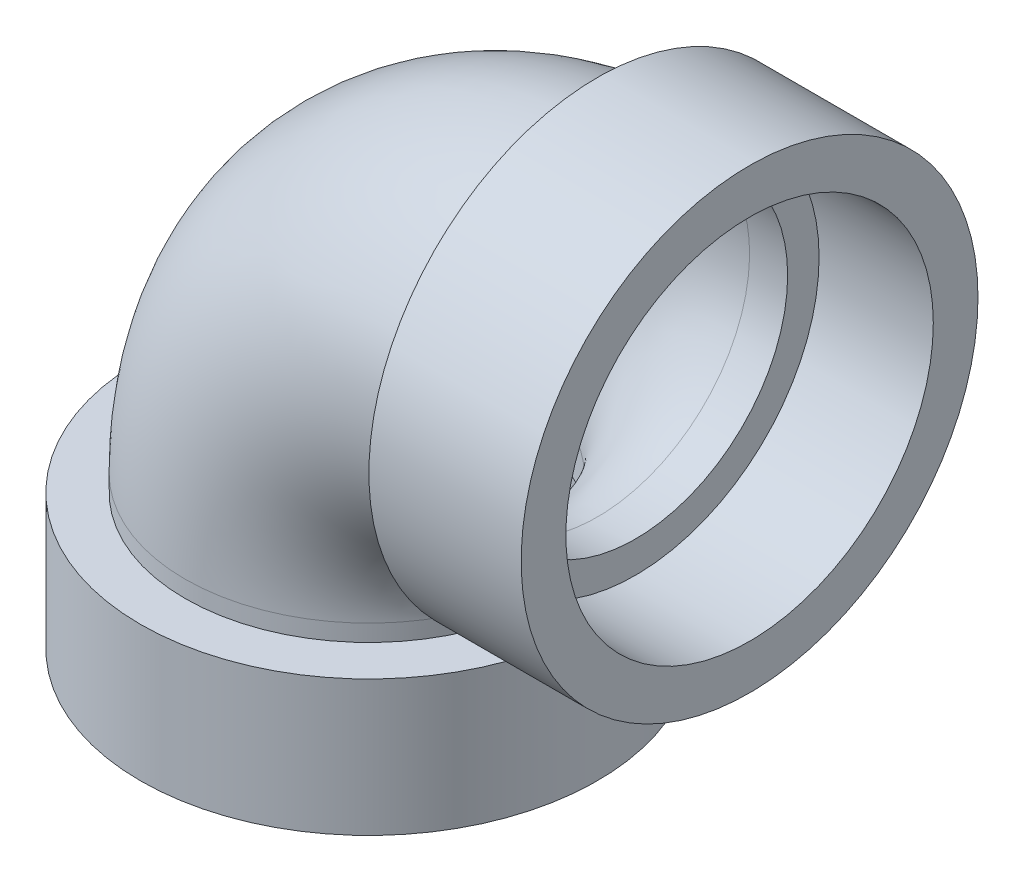
ISO-10303-21;
HEADER;
FILE_DESCRIPTION(('STEP AP214'),'2;1');
FILE_NAME('part.step','',(''),(''),'','','');
FILE_SCHEMA(('AUTOMOTIVE_DESIGN { 1 0 10303 214 1 1 1 1 }'));
ENDSEC;
DATA;
#1=APPLICATION_CONTEXT('core data for automotive mechanical design processes');
#2=APPLICATION_PROTOCOL_DEFINITION('international standard','automotive_design',2000,#1);
#3=PRODUCT_CONTEXT('',#1,'mechanical');
#4=PRODUCT('Part','Part','',(#3));
#5=PRODUCT_RELATED_PRODUCT_CATEGORY('part','',(#4));
#6=PRODUCT_DEFINITION_FORMATION('','',#4);
#7=PRODUCT_DEFINITION_CONTEXT('part definition',#1,'design');
#8=PRODUCT_DEFINITION('design','',#6,#7);
#9=PRODUCT_DEFINITION_SHAPE('','',#8);
#10=(LENGTH_UNIT() NAMED_UNIT(*) SI_UNIT(.MILLI.,.METRE.));
#11=(NAMED_UNIT(*) PLANE_ANGLE_UNIT() SI_UNIT($,.RADIAN.));
#12=(NAMED_UNIT(*) SI_UNIT($,.STERADIAN.) SOLID_ANGLE_UNIT());
#13=UNCERTAINTY_MEASURE_WITH_UNIT(LENGTH_MEASURE(1.E-05),#10,'distance_accuracy_value','');
#14=(GEOMETRIC_REPRESENTATION_CONTEXT(3) GLOBAL_UNCERTAINTY_ASSIGNED_CONTEXT((#13)) GLOBAL_UNIT_ASSIGNED_CONTEXT((#10,
#11,#12)) REPRESENTATION_CONTEXT('',''));
#15=CARTESIAN_POINT('',(0.,0.,0.));
#16=DIRECTION('',(0.,0.,1.));
#17=DIRECTION('',(1.,0.,0.));
#18=AXIS2_PLACEMENT_3D('',#15,#16,#17);
#19=CARTESIAN_POINT('',(0.,0.,0.));
#20=DIRECTION('',(0.,1.,0.));
#21=DIRECTION('',(0.,0.,1.));
#22=AXIS2_PLACEMENT_3D('',#19,#20,#21);
#23=CYLINDRICAL_SURFACE('',#22,30.);
#24=CARTESIAN_POINT('',(0.,0.,0.));
#25=DIRECTION('',(0.,1.,0.));
#26=DIRECTION('',(0.,0.,1.));
#27=AXIS2_PLACEMENT_3D('',#24,#25,#26);
#28=CIRCLE('',#27,30.);
#29=CARTESIAN_POINT('',(0.,0.,30.));
#30=VERTEX_POINT('',#29);
#31=EDGE_CURVE('E47',#30,#30,#28,.T.);
#32=ORIENTED_EDGE('',*,*,#31,.T.);
#33=EDGE_LOOP('',(#32));
#34=FACE_BOUND('',#33,.T.);
#35=CARTESIAN_POINT('',(0.,17.8,0.));
#36=DIRECTION('',(0.,1.,0.));
#37=DIRECTION('',(0.,0.,1.));
#38=AXIS2_PLACEMENT_3D('',#35,#36,#37);
#39=CIRCLE('',#38,30.);
#40=CARTESIAN_POINT('',(0.,17.8,30.));
#41=VERTEX_POINT('',#40);
#42=EDGE_CURVE('E154',#41,#41,#39,.T.);
#43=ORIENTED_EDGE('',*,*,#42,.F.);
#44=EDGE_LOOP('',(#43));
#45=FACE_BOUND('',#44,.T.);
#46=ADVANCED_FACE('F39',(#34,#45),#23,.T.);
#47=CARTESIAN_POINT('',(0.,0.,0.));
#48=DIRECTION('',(0.,1.,0.));
#49=DIRECTION('',(0.,0.,1.));
#50=AXIS2_PLACEMENT_3D('',#47,#48,#49);
#51=PLANE('',#50);
#52=CARTESIAN_POINT('',(0.,0.,0.));
#53=DIRECTION('',(0.,-1.,0.));
#54=DIRECTION('',(0.,0.,-1.));
#55=AXIS2_PLACEMENT_3D('',#52,#53,#54);
#56=CIRCLE('',#55,24.13);
#57=CARTESIAN_POINT('',(0.,0.,-24.13));
#58=VERTEX_POINT('',#57);
#59=EDGE_CURVE('E61',#58,#58,#56,.T.);
#60=ORIENTED_EDGE('',*,*,#59,.F.);
#61=EDGE_LOOP('',(#60));
#62=FACE_BOUND('',#61,.T.);
#63=ORIENTED_EDGE('',*,*,#31,.F.);
#64=EDGE_LOOP('',(#63));
#65=FACE_BOUND('',#64,.T.);
#66=ADVANCED_FACE('F41',(#62,#65),#51,.F.);
#67=CARTESIAN_POINT('',(50.,50.,0.));
#68=DIRECTION('',(1.,0.,0.));
#69=DIRECTION('',(0.,0.,1.));
#70=AXIS2_PLACEMENT_3D('',#67,#68,#69);
#71=PLANE('',#70);
#72=CARTESIAN_POINT('',(50.,50.,0.));
#73=DIRECTION('',(1.,0.,0.));
#74=DIRECTION('',(0.,0.,-1.));
#75=AXIS2_PLACEMENT_3D('',#72,#73,#74);
#76=CIRCLE('',#75,24.13);
#77=CARTESIAN_POINT('',(50.,50.,-24.13));
#78=VERTEX_POINT('',#77);
#79=EDGE_CURVE('E75',#78,#78,#76,.T.);
#80=ORIENTED_EDGE('',*,*,#79,.F.);
#81=EDGE_LOOP('',(#80));
#82=FACE_BOUND('',#81,.T.);
#83=CARTESIAN_POINT('',(50.,50.,0.));
#84=DIRECTION('',(1.,0.,0.));
#85=DIRECTION('',(0.,0.,1.));
#86=AXIS2_PLACEMENT_3D('',#83,#84,#85);
#87=CIRCLE('',#86,30.);
#88=CARTESIAN_POINT('',(50.,50.,-30.));
#89=VERTEX_POINT('',#88);
#90=EDGE_CURVE('E10',#89,#89,#87,.T.);
#91=ORIENTED_EDGE('',*,*,#90,.T.);
#92=EDGE_LOOP('',(#91));
#93=FACE_BOUND('',#92,.T.);
#94=ADVANCED_FACE('F84',(#82,#93),#71,.T.);
#95=CARTESIAN_POINT('',(30.,50.,0.));
#96=DIRECTION('',(1.,0.,0.));
#97=DIRECTION('',(0.,0.,-1.));
#98=AXIS2_PLACEMENT_3D('',#95,#96,#97);
#99=CYLINDRICAL_SURFACE('',#98,30.);
#100=CARTESIAN_POINT('',(30.,50.,0.));
#101=DIRECTION('',(1.,0.,0.));
#102=DIRECTION('',(0.,0.,1.));
#103=AXIS2_PLACEMENT_3D('',#100,#101,#102);
#104=CIRCLE('',#103,30.);
#105=CARTESIAN_POINT('',(30.,50.,-30.));
#106=VERTEX_POINT('',#105);
#107=EDGE_CURVE('E150',#106,#106,#104,.T.);
#108=CARTESIAN_POINT('',(50.,50.,-30.));
#109=CARTESIAN_POINT('',(49.7916666666667,50.,-30.));
#110=CARTESIAN_POINT('',(49.5833333333333,50.,-30.));
#111=CARTESIAN_POINT('',(49.1666666666667,50.,-30.));
#112=CARTESIAN_POINT('',(48.9583333333333,50.,-30.));
#113=CARTESIAN_POINT('',(48.5416666666667,50.,-30.));
#114=CARTESIAN_POINT('',(48.3333333333333,50.,-30.));
#115=CARTESIAN_POINT('',(47.9166666666667,50.,-30.));
#116=CARTESIAN_POINT('',(47.7083333333333,50.,-30.));
#117=CARTESIAN_POINT('',(47.2916666666667,50.,-30.));
#118=CARTESIAN_POINT('',(47.0833333333333,50.,-30.));
#119=CARTESIAN_POINT('',(46.6666666666667,50.,-30.));
#120=CARTESIAN_POINT('',(46.4583333333333,50.,-30.));
#121=CARTESIAN_POINT('',(46.0416666666667,50.,-30.));
#122=CARTESIAN_POINT('',(45.8333333333333,50.,-30.));
#123=CARTESIAN_POINT('',(45.4166666666667,50.,-30.));
#124=CARTESIAN_POINT('',(45.2083333333333,50.,-30.));
#125=CARTESIAN_POINT('',(44.7916666666667,50.,-30.));
#126=CARTESIAN_POINT('',(44.5833333333333,50.,-30.));
#127=CARTESIAN_POINT('',(44.1666666666667,50.,-30.));
#128=CARTESIAN_POINT('',(43.9583333333333,50.,-30.));
#129=CARTESIAN_POINT('',(43.5416666666667,50.,-30.));
#130=CARTESIAN_POINT('',(43.3333333333333,50.,-30.));
#131=CARTESIAN_POINT('',(42.9166666666667,50.,-30.));
#132=CARTESIAN_POINT('',(42.7083333333333,50.,-30.));
#133=CARTESIAN_POINT('',(42.2916666666667,50.,-30.));
#134=CARTESIAN_POINT('',(42.0833333333333,50.,-30.));
#135=CARTESIAN_POINT('',(41.6666666666667,50.,-30.));
#136=CARTESIAN_POINT('',(41.4583333333333,50.,-30.));
#137=CARTESIAN_POINT('',(41.0416666666667,50.,-30.));
#138=CARTESIAN_POINT('',(40.8333333333333,50.,-30.));
#139=CARTESIAN_POINT('',(40.4166666666667,50.,-30.));
#140=CARTESIAN_POINT('',(40.2083333333333,50.,-30.));
#141=CARTESIAN_POINT('',(39.7916666666667,50.,-30.));
#142=CARTESIAN_POINT('',(39.5833333333333,50.,-30.));
#143=CARTESIAN_POINT('',(39.1666666666667,50.,-30.));
#144=CARTESIAN_POINT('',(38.9583333333333,50.,-30.));
#145=CARTESIAN_POINT('',(38.5416666666667,50.,-30.));
#146=CARTESIAN_POINT('',(38.3333333333333,50.,-30.));
#147=CARTESIAN_POINT('',(37.9166666666667,50.,-30.));
#148=CARTESIAN_POINT('',(37.7083333333333,50.,-30.));
#149=CARTESIAN_POINT('',(37.2916666666667,50.,-30.));
#150=CARTESIAN_POINT('',(37.0833333333333,50.,-30.));
#151=CARTESIAN_POINT('',(36.6666666666667,50.,-30.));
#152=CARTESIAN_POINT('',(36.4583333333333,50.,-30.));
#153=CARTESIAN_POINT('',(36.0416666666667,50.,-30.));
#154=CARTESIAN_POINT('',(35.8333333333333,50.,-30.));
#155=CARTESIAN_POINT('',(35.4166666666667,50.,-30.));
#156=CARTESIAN_POINT('',(35.2083333333333,50.,-30.));
#157=CARTESIAN_POINT('',(34.7916666666667,50.,-30.));
#158=CARTESIAN_POINT('',(34.5833333333333,50.,-30.));
#159=CARTESIAN_POINT('',(34.1666666666667,50.,-30.));
#160=CARTESIAN_POINT('',(33.9583333333333,50.,-30.));
#161=CARTESIAN_POINT('',(33.5416666666667,50.,-30.));
#162=CARTESIAN_POINT('',(33.3333333333333,50.,-30.));
#163=CARTESIAN_POINT('',(32.9166666666667,50.,-30.));
#164=CARTESIAN_POINT('',(32.7083333333333,50.,-30.));
#165=CARTESIAN_POINT('',(32.2916666666667,50.,-30.));
#166=CARTESIAN_POINT('',(32.0833333333333,50.,-30.));
#167=CARTESIAN_POINT('',(31.6666666666667,50.,-30.));
#168=CARTESIAN_POINT('',(31.4583333333333,50.,-30.));
#169=CARTESIAN_POINT('',(31.0416666666667,50.,-30.));
#170=CARTESIAN_POINT('',(30.8333333333333,50.,-30.));
#171=CARTESIAN_POINT('',(30.4166666666667,50.,-30.));
#172=CARTESIAN_POINT('',(30.2083333333333,50.,-30.));
#173=CARTESIAN_POINT('',(30.,50.,-30.));
#174=B_SPLINE_CURVE_WITH_KNOTS('',3,(#108,#109,#110,#111,#112,#113,#114,#115,#116,#117,#118,
#119,#120,#121,#122,#123,#124,#125,#126,#127,#128,#129,#130,#131,#132,#133,#134,#135,#136,#137,
#138,#139,#140,#141,#142,#143,#144,#145,#146,#147,#148,#149,#150,#151,#152,#153,#154,#155,#156,
#157,#158,#159,#160,#161,#162,#163,#164,#165,#166,#167,#168,#169,#170,#171,#172,#173),
.UNSPECIFIED.,.F.,.F.,(4,2,2,2,2,2,2,2,2,2,2,2,2,2,2,2,2,2,2,2,2,2,2,2,2,2,2,2,2,2,2,2,4),(0.,
0.625000000000001,1.25,1.875,2.5,3.125,3.75,4.375,5.,5.625,6.25,6.875,7.5,8.125,8.75,9.375,10.,
10.625,11.25,11.875,12.5,13.125,13.75,14.375,15.,15.625,16.25,16.875,17.5,18.125,18.75,19.375,
20.),.UNSPECIFIED.);
#175=EDGE_CURVE('BSEAM86',#89,#106,#174,.T.);
#176=ORIENTED_EDGE('',*,*,#90,.F.);
#177=ORIENTED_EDGE('',*,*,#107,.T.);
#178=ORIENTED_EDGE('',*,*,#175,.T.);
#179=ORIENTED_EDGE('',*,*,#175,.F.);
#180=EDGE_LOOP('',(#176,#178,#177,#179));
#181=FACE_BOUND('',#180,.T.);
#182=ADVANCED_FACE('F86',(#181),#99,.T.);
#183=CARTESIAN_POINT('',(35.,50.,0.));
#184=DIRECTION('',(1.,0.,0.));
#185=DIRECTION('',(0.,0.,-1.));
#186=AXIS2_PLACEMENT_3D('',#183,#184,#185);
#187=CYLINDRICAL_SURFACE('',#186,24.13);
#188=CARTESIAN_POINT('',(35.,50.,0.));
#189=DIRECTION('',(1.,0.,0.));
#190=DIRECTION('',(0.,0.,-1.));
#191=AXIS2_PLACEMENT_3D('',#188,#189,#190);
#192=CIRCLE('',#191,24.13);
#193=CARTESIAN_POINT('',(35.,50.,-24.13));
#194=VERTEX_POINT('',#193);
#195=EDGE_CURVE('E52',#194,#194,#192,.T.);
#196=ORIENTED_EDGE('',*,*,#195,.F.);
#197=EDGE_LOOP('',(#196));
#198=FACE_BOUND('',#197,.T.);
#199=ORIENTED_EDGE('',*,*,#79,.T.);
#200=EDGE_LOOP('',(#199));
#201=FACE_BOUND('',#200,.T.);
#202=ADVANCED_FACE('F82',(#198,#201),#187,.F.);
#203=CARTESIAN_POINT('',(35.,50.,0.));
#204=DIRECTION('',(1.,0.,0.));
#205=DIRECTION('',(0.,0.,-1.));
#206=AXIS2_PLACEMENT_3D('',#203,#204,#205);
#207=PLANE('',#206);
#208=CARTESIAN_POINT('',(35.,50.,0.));
#209=DIRECTION('',(1.,0.,0.));
#210=DIRECTION('',(0.,0.,-1.));
#211=AXIS2_PLACEMENT_3D('',#208,#209,#210);
#212=CIRCLE('',#211,20.);
#213=CARTESIAN_POINT('',(35.,50.,-20.));
#214=VERTEX_POINT('',#213);
#215=EDGE_CURVE('E43',#214,#214,#212,.T.);
#216=ORIENTED_EDGE('',*,*,#215,.F.);
#217=EDGE_LOOP('',(#216));
#218=FACE_BOUND('',#217,.T.);
#219=ORIENTED_EDGE('',*,*,#195,.T.);
#220=EDGE_LOOP('',(#219));
#221=FACE_BOUND('',#220,.T.);
#222=ADVANCED_FACE('F104',(#218,#221),#207,.T.);
#223=CARTESIAN_POINT('',(0.,15.,0.));
#224=DIRECTION('',(0.,-1.,0.));
#225=DIRECTION('',(0.,0.,-1.));
#226=AXIS2_PLACEMENT_3D('',#223,#224,#225);
#227=CYLINDRICAL_SURFACE('',#226,24.13);
#228=CARTESIAN_POINT('',(0.,15.,0.));
#229=DIRECTION('',(0.,-1.,0.));
#230=DIRECTION('',(0.,0.,-1.));
#231=AXIS2_PLACEMENT_3D('',#228,#229,#230);
#232=CIRCLE('',#231,24.13);
#233=CARTESIAN_POINT('',(0.,15.,-24.13));
#234=VERTEX_POINT('',#233);
#235=EDGE_CURVE('E72',#234,#234,#232,.T.);
#236=ORIENTED_EDGE('',*,*,#235,.F.);
#237=EDGE_LOOP('',(#236));
#238=FACE_BOUND('',#237,.T.);
#239=ORIENTED_EDGE('',*,*,#59,.T.);
#240=EDGE_LOOP('',(#239));
#241=FACE_BOUND('',#240,.T.);
#242=ADVANCED_FACE('F108',(#238,#241),#227,.F.);
#243=CARTESIAN_POINT('',(0.,15.,0.));
#244=DIRECTION('',(0.,-1.,0.));
#245=DIRECTION('',(0.,0.,-1.));
#246=AXIS2_PLACEMENT_3D('',#243,#244,#245);
#247=PLANE('',#246);
#248=CARTESIAN_POINT('',(0.,15.,0.));
#249=DIRECTION('',(0.,-1.,0.));
#250=DIRECTION('',(0.,0.,-1.));
#251=AXIS2_PLACEMENT_3D('',#248,#249,#250);
#252=CIRCLE('',#251,20.);
#253=CARTESIAN_POINT('',(0.,15.,-20.));
#254=VERTEX_POINT('',#253);
#255=EDGE_CURVE('E55',#254,#254,#252,.T.);
#256=ORIENTED_EDGE('',*,*,#255,.F.);
#257=EDGE_LOOP('',(#256));
#258=FACE_BOUND('',#257,.T.);
#259=ORIENTED_EDGE('',*,*,#235,.T.);
#260=EDGE_LOOP('',(#259));
#261=FACE_BOUND('',#260,.T.);
#262=ADVANCED_FACE('F112',(#258,#261),#247,.T.);
#263=CARTESIAN_POINT('',(50.,50.,0.));
#264=DIRECTION('',(-1.,0.,0.));
#265=DIRECTION('',(0.,0.,1.));
#266=AXIS2_PLACEMENT_3D('',#263,#264,#265);
#267=CYLINDRICAL_SURFACE('',#266,20.);
#268=ORIENTED_EDGE('',*,*,#215,.T.);
#269=EDGE_LOOP('',(#268));
#270=FACE_BOUND('',#269,.T.);
#271=CARTESIAN_POINT('',(30.,50.,0.));
#272=DIRECTION('',(-1.,0.,0.));
#273=DIRECTION('',(0.,0.,-1.));
#274=AXIS2_PLACEMENT_3D('',#271,#272,#273);
#275=CIRCLE('',#274,20.);
#276=CARTESIAN_POINT('',(30.,70.,0.));
#277=VERTEX_POINT('',#276);
#278=EDGE_CURVE('E63',#277,#277,#275,.T.);
#279=ORIENTED_EDGE('',*,*,#278,.T.);
#280=EDGE_LOOP('',(#279));
#281=FACE_BOUND('',#280,.T.);
#282=ADVANCED_FACE('F116',(#270,#281),#267,.F.);
#283=CARTESIAN_POINT('',(30.,20.,0.));
#284=DIRECTION('',(0.,0.,1.));
#285=DIRECTION('',(1.,0.,0.));
#286=AXIS2_PLACEMENT_3D('',#283,#284,#285);
#287=TOROIDAL_SURFACE('',#286,30.,20.);
#288=CARTESIAN_POINT('',(0.,20.,0.));
#289=DIRECTION('',(0.,-1.,0.));
#290=DIRECTION('',(0.,0.,-1.));
#291=AXIS2_PLACEMENT_3D('',#288,#289,#290);
#292=CIRCLE('',#291,20.);
#293=CARTESIAN_POINT('',(-20.,20.,0.));
#294=VERTEX_POINT('',#293);
#295=EDGE_CURVE('E57',#294,#294,#292,.T.);
#296=CARTESIAN_POINT('',(30.,20.,0.));
#297=DIRECTION('',(0.,0.,1.));
#298=DIRECTION('',(1.,0.,0.));
#299=AXIS2_PLACEMENT_3D('',#296,#297,#298);
#300=CIRCLE('',#299,50.);
#301=EDGE_CURVE('',#277,#294,#300,.T.);
#302=ORIENTED_EDGE('',*,*,#278,.F.);
#303=ORIENTED_EDGE('',*,*,#295,.T.);
#304=ORIENTED_EDGE('',*,*,#301,.T.);
#305=ORIENTED_EDGE('',*,*,#301,.F.);
#306=EDGE_LOOP('',(#302,#304,#303,#305));
#307=FACE_BOUND('',#306,.T.);
#308=ADVANCED_FACE('F121',(#307),#287,.F.);
#309=CARTESIAN_POINT('',(0.,20.,0.));
#310=DIRECTION('',(0.,-1.,0.));
#311=DIRECTION('',(0.,0.,-1.));
#312=AXIS2_PLACEMENT_3D('',#309,#310,#311);
#313=CYLINDRICAL_SURFACE('',#312,20.);
#314=ORIENTED_EDGE('',*,*,#255,.T.);
#315=EDGE_LOOP('',(#314));
#316=FACE_BOUND('',#315,.T.);
#317=ORIENTED_EDGE('',*,*,#295,.F.);
#318=EDGE_LOOP('',(#317));
#319=FACE_BOUND('',#318,.T.);
#320=ADVANCED_FACE('F118',(#316,#319),#313,.F.);
#321=CARTESIAN_POINT('',(0.,17.8,0.));
#322=DIRECTION('',(0.,1.,0.));
#323=DIRECTION('',(0.,0.,1.));
#324=AXIS2_PLACEMENT_3D('',#321,#322,#323);
#325=PLANE('',#324);
#326=CARTESIAN_POINT('',(0.,17.8,0.));
#327=DIRECTION('',(0.,1.,0.));
#328=DIRECTION('',(0.,0.,1.));
#329=AXIS2_PLACEMENT_3D('',#326,#327,#328);
#330=CIRCLE('',#329,24.13);
#331=CARTESIAN_POINT('',(0.,17.8,24.13));
#332=VERTEX_POINT('',#331);
#333=EDGE_CURVE('E149',#332,#332,#330,.F.);
#334=ORIENTED_EDGE('',*,*,#333,.T.);
#335=EDGE_LOOP('',(#334));
#336=FACE_BOUND('',#335,.T.);
#337=ORIENTED_EDGE('',*,*,#42,.T.);
#338=EDGE_LOOP('',(#337));
#339=FACE_BOUND('',#338,.T.);
#340=ADVANCED_FACE('F120',(#336,#339),#325,.T.);
#341=CARTESIAN_POINT('',(30.,50.,0.));
#342=DIRECTION('',(1.,0.,0.));
#343=DIRECTION('',(0.,0.,1.));
#344=AXIS2_PLACEMENT_3D('',#341,#342,#343);
#345=PLANE('',#344);
#346=CARTESIAN_POINT('',(30.,50.,0.));
#347=DIRECTION('',(1.,0.,0.));
#348=DIRECTION('',(0.,0.,1.));
#349=AXIS2_PLACEMENT_3D('',#346,#347,#348);
#350=CIRCLE('',#349,24.13);
#351=CARTESIAN_POINT('',(30.,74.13,0.));
#352=VERTEX_POINT('',#351);
#353=EDGE_CURVE('E68',#352,#352,#350,.F.);
#354=ORIENTED_EDGE('',*,*,#353,.F.);
#355=EDGE_LOOP('',(#354));
#356=FACE_BOUND('',#355,.T.);
#357=ORIENTED_EDGE('',*,*,#107,.F.);
#358=EDGE_LOOP('',(#357));
#359=FACE_BOUND('',#358,.T.);
#360=ADVANCED_FACE('F130',(#356,#359),#345,.F.);
#361=CARTESIAN_POINT('',(0.,17.8,0.));
#362=DIRECTION('',(0.,1.,0.));
#363=DIRECTION('',(0.,0.,1.));
#364=AXIS2_PLACEMENT_3D('',#361,#362,#363);
#365=CYLINDRICAL_SURFACE('',#364,24.13);
#366=CARTESIAN_POINT('',(0.,20.,0.));
#367=DIRECTION('',(0.,1.,0.));
#368=DIRECTION('',(0.,0.,1.));
#369=AXIS2_PLACEMENT_3D('',#366,#367,#368);
#370=CIRCLE('',#369,24.13);
#371=CARTESIAN_POINT('',(-24.13,20.,0.));
#372=VERTEX_POINT('',#371);
#373=EDGE_CURVE('E146',#372,#372,#370,.F.);
#374=ORIENTED_EDGE('',*,*,#373,.T.);
#375=EDGE_LOOP('',(#374));
#376=FACE_BOUND('',#375,.T.);
#377=ORIENTED_EDGE('',*,*,#333,.F.);
#378=EDGE_LOOP('',(#377));
#379=FACE_BOUND('',#378,.T.);
#380=ADVANCED_FACE('F134',(#376,#379),#365,.T.);
#381=CARTESIAN_POINT('',(30.,20.,0.));
#382=DIRECTION('',(0.,0.,-1.));
#383=DIRECTION('',(-1.,0.,0.));
#384=AXIS2_PLACEMENT_3D('',#381,#382,#383);
#385=TOROIDAL_SURFACE('',#384,30.,24.13);
#386=CARTESIAN_POINT('',(30.,20.,0.));
#387=DIRECTION('',(0.,0.,-1.));
#388=DIRECTION('',(-1.,0.,0.));
#389=AXIS2_PLACEMENT_3D('',#386,#387,#388);
#390=CIRCLE('',#389,54.13);
#391=EDGE_CURVE('',#372,#352,#390,.T.);
#392=ORIENTED_EDGE('',*,*,#373,.F.);
#393=ORIENTED_EDGE('',*,*,#353,.T.);
#394=ORIENTED_EDGE('',*,*,#391,.T.);
#395=ORIENTED_EDGE('',*,*,#391,.F.);
#396=EDGE_LOOP('',(#392,#394,#393,#395));
#397=FACE_BOUND('',#396,.T.);
#398=ADVANCED_FACE('F127',(#397),#385,.T.);
#399=CLOSED_SHELL('',(#46,#66,#94,#182,#202,#222,#242,#262,#282,#308,#320,#340,#360,#380,#398));
#400=MANIFOLD_SOLID_BREP('B2',#399);
#401=ADVANCED_BREP_SHAPE_REPRESENTATION('',(#18,#400),#14);
#402=SHAPE_DEFINITION_REPRESENTATION(#9,#401);
ENDSEC;
END-ISO-10303-21;
